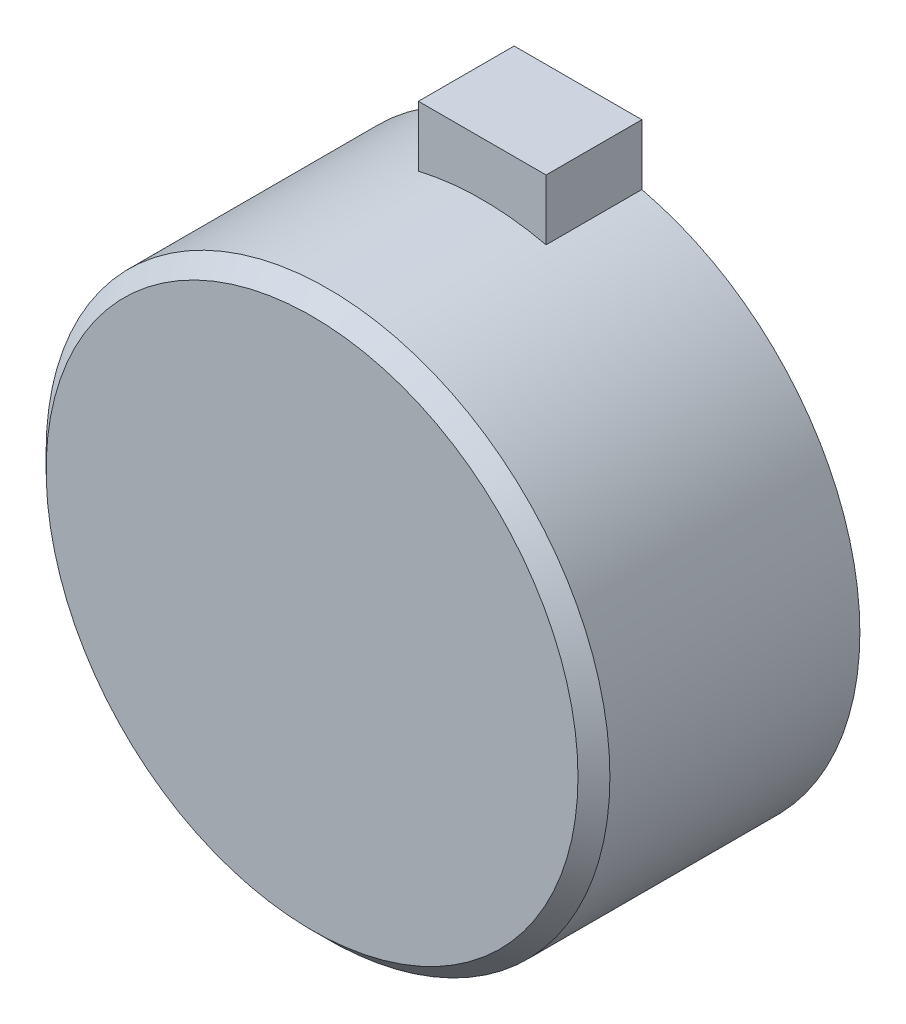
ISO-10303-21;
HEADER;
FILE_DESCRIPTION(('STEP AP214'),'2;1');
FILE_NAME('part.step','',(''),(''),'','','');
FILE_SCHEMA(('AUTOMOTIVE_DESIGN { 1 0 10303 214 1 1 1 1 }'));
ENDSEC;
DATA;
#1=APPLICATION_CONTEXT('core data for automotive mechanical design processes');
#2=APPLICATION_PROTOCOL_DEFINITION('international standard','automotive_design',2000,#1);
#3=PRODUCT_CONTEXT('',#1,'mechanical');
#4=PRODUCT('Part','Part','',(#3));
#5=PRODUCT_RELATED_PRODUCT_CATEGORY('part','',(#4));
#6=PRODUCT_DEFINITION_FORMATION('','',#4);
#7=PRODUCT_DEFINITION_CONTEXT('part definition',#1,'design');
#8=PRODUCT_DEFINITION('design','',#6,#7);
#9=PRODUCT_DEFINITION_SHAPE('','',#8);
#10=(LENGTH_UNIT() NAMED_UNIT(*) SI_UNIT(.MILLI.,.METRE.));
#11=(NAMED_UNIT(*) PLANE_ANGLE_UNIT() SI_UNIT($,.RADIAN.));
#12=(NAMED_UNIT(*) SI_UNIT($,.STERADIAN.) SOLID_ANGLE_UNIT());
#13=UNCERTAINTY_MEASURE_WITH_UNIT(LENGTH_MEASURE(1.E-05),#10,'distance_accuracy_value','');
#14=(GEOMETRIC_REPRESENTATION_CONTEXT(3) GLOBAL_UNCERTAINTY_ASSIGNED_CONTEXT((#13)) GLOBAL_UNIT_ASSIGNED_CONTEXT((#10,
#11,#12)) REPRESENTATION_CONTEXT('',''));
#15=CARTESIAN_POINT('',(0.,0.,0.));
#16=DIRECTION('',(0.,0.,1.));
#17=DIRECTION('',(1.,0.,0.));
#18=AXIS2_PLACEMENT_3D('',#15,#16,#17);
#19=CARTESIAN_POINT('',(0.,0.,10.));
#20=DIRECTION('',(0.,0.,1.));
#21=DIRECTION('',(1.,0.,0.));
#22=AXIS2_PLACEMENT_3D('',#19,#20,#21);
#23=CYLINDRICAL_SURFACE('',#22,53.);
#24=CARTESIAN_POINT('',(0.,0.,-3.));
#25=DIRECTION('',(0.,0.,1.));
#26=DIRECTION('',(1.,0.,0.));
#27=AXIS2_PLACEMENT_3D('',#24,#25,#26);
#28=CIRCLE('',#27,53.);
#29=CARTESIAN_POINT('',(53.,0.,-3.));
#30=VERTEX_POINT('',#29);
#31=EDGE_CURVE('E161',#30,#30,#28,.T.);
#32=ORIENTED_EDGE('',*,*,#31,.F.);
#33=EDGE_LOOP('',(#32));
#34=FACE_BOUND('',#33,.T.);
#35=CARTESIAN_POINT('',(0.,0.,-32.));
#36=DIRECTION('',(0.,0.,1.));
#37=DIRECTION('',(1.,0.,0.));
#38=AXIS2_PLACEMENT_3D('',#35,#36,#37);
#39=CIRCLE('',#38,53.);
#40=CARTESIAN_POINT('',(-12.,51.6236379965612,-32.));
#41=VERTEX_POINT('',#40);
#42=CARTESIAN_POINT('',(12.,51.6236379965612,-32.));
#43=VERTEX_POINT('',#42);
#44=EDGE_CURVE('E11',#41,#43,#39,.F.);
#45=ORIENTED_EDGE('',*,*,#44,.F.);
#46=DIRECTION('',(0.,0.,1.));
#47=VECTOR('',#46,1.);
#48=CARTESIAN_POINT('',(-12.,51.6236379965612,10.));
#49=LINE('',#48,#47);
#50=CARTESIAN_POINT('',(-12.,51.6236379965612,-50.));
#51=VERTEX_POINT('',#50);
#52=EDGE_CURVE('E57',#41,#51,#49,.F.);
#53=ORIENTED_EDGE('',*,*,#52,.T.);
#54=CARTESIAN_POINT('',(0.,0.,-50.));
#55=DIRECTION('',(0.,0.,1.));
#56=DIRECTION('',(1.,0.,0.));
#57=AXIS2_PLACEMENT_3D('',#54,#55,#56);
#58=CIRCLE('',#57,53.);
#59=CARTESIAN_POINT('',(12.,51.6236379965612,-50.));
#60=VERTEX_POINT('',#59);
#61=EDGE_CURVE('E160',#51,#60,#58,.T.);
#62=ORIENTED_EDGE('',*,*,#61,.T.);
#63=DIRECTION('',(0.,0.,1.));
#64=VECTOR('',#63,1.);
#65=CARTESIAN_POINT('',(12.,51.6236379965612,10.));
#66=LINE('',#65,#64);
#67=EDGE_CURVE('E91',#60,#43,#66,.T.);
#68=ORIENTED_EDGE('',*,*,#67,.T.);
#69=EDGE_LOOP('',(#45,#53,#62,#68));
#70=FACE_BOUND('',#69,.T.);
#71=ADVANCED_FACE('F39',(#34,#70),#23,.T.);
#72=CARTESIAN_POINT('',(0.,0.,0.));
#73=DIRECTION('',(0.,0.,1.));
#74=DIRECTION('',(1.,0.,0.));
#75=AXIS2_PLACEMENT_3D('',#72,#73,#74);
#76=PLANE('',#75);
#77=CARTESIAN_POINT('',(0.,0.,0.));
#78=DIRECTION('',(0.,0.,1.));
#79=DIRECTION('',(1.,0.,0.));
#80=AXIS2_PLACEMENT_3D('',#77,#78,#79);
#81=CIRCLE('',#80,50.);
#82=CARTESIAN_POINT('',(50.,0.,0.));
#83=VERTEX_POINT('',#82);
#84=EDGE_CURVE('E50',#83,#83,#81,.T.);
#85=ORIENTED_EDGE('',*,*,#84,.T.);
#86=EDGE_LOOP('',(#85));
#87=FACE_BOUND('',#86,.T.);
#88=ADVANCED_FACE('F41',(#87),#76,.T.);
#89=CARTESIAN_POINT('',(0.,0.,0.));
#90=DIRECTION('',(0.,0.,-1.));
#91=DIRECTION('',(-1.,0.,0.));
#92=AXIS2_PLACEMENT_3D('',#89,#90,#91);
#93=CONICAL_SURFACE('',#92,50.,0.785398163397449);
#94=ORIENTED_EDGE('',*,*,#31,.T.);
#95=EDGE_LOOP('',(#94));
#96=FACE_BOUND('',#95,.T.);
#97=ORIENTED_EDGE('',*,*,#84,.F.);
#98=EDGE_LOOP('',(#97));
#99=FACE_BOUND('',#98,.T.);
#100=ADVANCED_FACE('F170',(#96,#99),#93,.T.);
#101=CARTESIAN_POINT('',(50.,0.,-50.));
#102=DIRECTION('',(0.,0.,-1.));
#103=DIRECTION('',(-1.,0.,0.));
#104=AXIS2_PLACEMENT_3D('',#101,#102,#103);
#105=PLANE('',#104);
#106=ORIENTED_EDGE('',*,*,#61,.F.);
#107=DIRECTION('',(0.,-1.,0.));
#108=VECTOR('',#107,1.);
#109=CARTESIAN_POINT('',(-12.,63.,-50.));
#110=LINE('',#109,#108);
#111=CARTESIAN_POINT('',(-12.,63.,-50.));
#112=VERTEX_POINT('',#111);
#113=EDGE_CURVE('E103',#112,#51,#110,.T.);
#114=ORIENTED_EDGE('',*,*,#113,.F.);
#115=DIRECTION('',(-1.,0.,0.));
#116=VECTOR('',#115,1.);
#117=CARTESIAN_POINT('',(12.,63.,-50.));
#118=LINE('',#117,#116);
#119=CARTESIAN_POINT('',(12.,63.,-50.));
#120=VERTEX_POINT('',#119);
#121=EDGE_CURVE('E110',#120,#112,#118,.T.);
#122=ORIENTED_EDGE('',*,*,#121,.F.);
#123=DIRECTION('',(0.,1.,0.));
#124=VECTOR('',#123,1.);
#125=CARTESIAN_POINT('',(12.,49.,-50.));
#126=LINE('',#125,#124);
#127=EDGE_CURVE('E89',#60,#120,#126,.T.);
#128=ORIENTED_EDGE('',*,*,#127,.F.);
#129=EDGE_LOOP('',(#106,#114,#122,#128));
#130=FACE_BOUND('',#129,.T.);
#131=CARTESIAN_POINT('',(0.,43.,-50.));
#132=DIRECTION('',(0.,0.,1.));
#133=DIRECTION('',(0.,1.,0.));
#134=AXIS2_PLACEMENT_3D('',#131,#132,#133);
#135=CIRCLE('',#134,1.65);
#136=CARTESIAN_POINT('',(0.,44.65,-50.));
#137=VERTEX_POINT('',#136);
#138=EDGE_CURVE('E126',#137,#137,#135,.T.);
#139=ORIENTED_EDGE('',*,*,#138,.T.);
#140=EDGE_LOOP('',(#139));
#141=FACE_BOUND('',#140,.T.);
#142=CARTESIAN_POINT('',(-30.4055915910215,30.4055915910215,-50.));
#143=DIRECTION('',(0.,0.,1.));
#144=DIRECTION('',(-0.707106781186547,0.707106781186548,0.));
#145=AXIS2_PLACEMENT_3D('',#142,#143,#144);
#146=CIRCLE('',#145,1.65);
#147=CARTESIAN_POINT('',(-31.5723177799793,31.5723177799793,-50.));
#148=VERTEX_POINT('',#147);
#149=EDGE_CURVE('E133',#148,#148,#146,.T.);
#150=ORIENTED_EDGE('',*,*,#149,.T.);
#151=EDGE_LOOP('',(#150));
#152=FACE_BOUND('',#151,.T.);
#153=CARTESIAN_POINT('',(-43.,0.,-50.));
#154=DIRECTION('',(0.,0.,1.));
#155=DIRECTION('',(-1.,0.,0.));
#156=AXIS2_PLACEMENT_3D('',#153,#154,#155);
#157=CIRCLE('',#156,1.65);
#158=CARTESIAN_POINT('',(-44.65,0.,-50.));
#159=VERTEX_POINT('',#158);
#160=EDGE_CURVE('E140',#159,#159,#157,.T.);
#161=ORIENTED_EDGE('',*,*,#160,.T.);
#162=EDGE_LOOP('',(#161));
#163=FACE_BOUND('',#162,.T.);
#164=CARTESIAN_POINT('',(-30.4055915910215,-30.4055915910215,-50.));
#165=DIRECTION('',(0.,0.,1.));
#166=DIRECTION('',(-0.707106781186548,-0.707106781186547,0.));
#167=AXIS2_PLACEMENT_3D('',#164,#165,#166);
#168=CIRCLE('',#167,1.65);
#169=CARTESIAN_POINT('',(-31.5723177799793,-31.5723177799793,-50.));
#170=VERTEX_POINT('',#169);
#171=EDGE_CURVE('E113',#170,#170,#168,.T.);
#172=ORIENTED_EDGE('',*,*,#171,.T.);
#173=EDGE_LOOP('',(#172));
#174=FACE_BOUND('',#173,.T.);
#175=CARTESIAN_POINT('',(0.,-43.,-50.));
#176=DIRECTION('',(0.,0.,1.));
#177=DIRECTION('',(0.,-1.,0.));
#178=AXIS2_PLACEMENT_3D('',#175,#176,#177);
#179=CIRCLE('',#178,1.65);
#180=CARTESIAN_POINT('',(0.,-44.65,-50.));
#181=VERTEX_POINT('',#180);
#182=EDGE_CURVE('E119',#181,#181,#179,.T.);
#183=ORIENTED_EDGE('',*,*,#182,.T.);
#184=EDGE_LOOP('',(#183));
#185=FACE_BOUND('',#184,.T.);
#186=CARTESIAN_POINT('',(30.4055915910215,-30.4055915910215,-50.));
#187=DIRECTION('',(0.,0.,1.));
#188=DIRECTION('',(0.707106781186547,-0.707106781186548,0.));
#189=AXIS2_PLACEMENT_3D('',#186,#187,#188);
#190=CIRCLE('',#189,1.65);
#191=CARTESIAN_POINT('',(31.5723177799793,-31.5723177799793,-50.));
#192=VERTEX_POINT('',#191);
#193=EDGE_CURVE('E112',#192,#192,#190,.T.);
#194=ORIENTED_EDGE('',*,*,#193,.T.);
#195=EDGE_LOOP('',(#194));
#196=FACE_BOUND('',#195,.T.);
#197=CARTESIAN_POINT('',(30.4055915910215,30.4055915910215,-50.));
#198=DIRECTION('',(0.,0.,1.));
#199=DIRECTION('',(0.707106781186548,0.707106781186548,0.));
#200=AXIS2_PLACEMENT_3D('',#197,#198,#199);
#201=CIRCLE('',#200,1.65);
#202=CARTESIAN_POINT('',(31.5723177799793,31.5723177799793,-50.));
#203=VERTEX_POINT('',#202);
#204=EDGE_CURVE('E130',#203,#203,#201,.T.);
#205=ORIENTED_EDGE('',*,*,#204,.T.);
#206=EDGE_LOOP('',(#205));
#207=FACE_BOUND('',#206,.T.);
#208=CARTESIAN_POINT('',(43.,0.,-50.));
#209=DIRECTION('',(0.,0.,1.));
#210=DIRECTION('',(1.,0.,0.));
#211=AXIS2_PLACEMENT_3D('',#208,#209,#210);
#212=CIRCLE('',#211,1.65);
#213=CARTESIAN_POINT('',(44.65,0.,-50.));
#214=VERTEX_POINT('',#213);
#215=EDGE_CURVE('E151',#214,#214,#212,.T.);
#216=ORIENTED_EDGE('',*,*,#215,.T.);
#217=EDGE_LOOP('',(#216));
#218=FACE_BOUND('',#217,.T.);
#219=ADVANCED_FACE('F166',(#130,#141,#152,#163,#174,#185,#196,#207,#218),#105,.T.);
#220=CARTESIAN_POINT('',(43.,0.,-42.));
#221=DIRECTION('',(0.,0.,-1.));
#222=DIRECTION('',(-1.,0.,0.));
#223=AXIS2_PLACEMENT_3D('',#220,#221,#222);
#224=CYLINDRICAL_SURFACE('',#223,1.65);
#225=CARTESIAN_POINT('',(43.,0.,-42.));
#226=DIRECTION('',(0.,0.,1.));
#227=DIRECTION('',(1.,0.,0.));
#228=AXIS2_PLACEMENT_3D('',#225,#226,#227);
#229=CIRCLE('',#228,1.65);
#230=CARTESIAN_POINT('',(44.65,0.,-42.));
#231=VERTEX_POINT('',#230);
#232=EDGE_CURVE('E152',#231,#231,#229,.T.);
#233=ORIENTED_EDGE('',*,*,#232,.T.);
#234=EDGE_LOOP('',(#233));
#235=FACE_BOUND('',#234,.T.);
#236=ORIENTED_EDGE('',*,*,#215,.F.);
#237=EDGE_LOOP('',(#236));
#238=FACE_BOUND('',#237,.T.);
#239=ADVANCED_FACE('F176',(#235,#238),#224,.F.);
#240=CARTESIAN_POINT('',(43.,0.,-42.));
#241=DIRECTION('',(0.,0.,1.));
#242=DIRECTION('',(1.,0.,0.));
#243=AXIS2_PLACEMENT_3D('',#240,#241,#242);
#244=PLANE('',#243);
#245=ORIENTED_EDGE('',*,*,#232,.F.);
#246=EDGE_LOOP('',(#245));
#247=FACE_BOUND('',#246,.T.);
#248=ADVANCED_FACE('F190',(#247),#244,.F.);
#249=CARTESIAN_POINT('',(30.4055915910215,30.4055915910215,-42.));
#250=DIRECTION('',(0.,0.,-1.));
#251=DIRECTION('',(-1.,0.,0.));
#252=AXIS2_PLACEMENT_3D('',#249,#250,#251);
#253=CYLINDRICAL_SURFACE('',#252,1.65);
#254=CARTESIAN_POINT('',(30.4055915910215,30.4055915910215,-42.));
#255=DIRECTION('',(0.,0.,1.));
#256=DIRECTION('',(0.707106781186548,0.707106781186548,0.));
#257=AXIS2_PLACEMENT_3D('',#254,#255,#256);
#258=CIRCLE('',#257,1.65);
#259=CARTESIAN_POINT('',(31.5723177799793,31.5723177799793,-42.));
#260=VERTEX_POINT('',#259);
#261=EDGE_CURVE('E146',#260,#260,#258,.T.);
#262=ORIENTED_EDGE('',*,*,#261,.T.);
#263=EDGE_LOOP('',(#262));
#264=FACE_BOUND('',#263,.T.);
#265=ORIENTED_EDGE('',*,*,#204,.F.);
#266=EDGE_LOOP('',(#265));
#267=FACE_BOUND('',#266,.T.);
#268=ADVANCED_FACE('F192',(#264,#267),#253,.F.);
#269=CARTESIAN_POINT('',(30.4055915910215,30.4055915910215,-42.));
#270=DIRECTION('',(0.,0.,1.));
#271=DIRECTION('',(0.707106781186548,0.707106781186548,0.));
#272=AXIS2_PLACEMENT_3D('',#269,#270,#271);
#273=PLANE('',#272);
#274=ORIENTED_EDGE('',*,*,#261,.F.);
#275=EDGE_LOOP('',(#274));
#276=FACE_BOUND('',#275,.T.);
#277=ADVANCED_FACE('F198',(#276),#273,.F.);
#278=CARTESIAN_POINT('',(30.4055915910215,-30.4055915910215,-42.));
#279=DIRECTION('',(0.,0.,-1.));
#280=DIRECTION('',(-1.,0.,0.));
#281=AXIS2_PLACEMENT_3D('',#278,#279,#280);
#282=CYLINDRICAL_SURFACE('',#281,1.65);
#283=CARTESIAN_POINT('',(30.4055915910215,-30.4055915910215,-42.));
#284=DIRECTION('',(0.,0.,1.));
#285=DIRECTION('',(0.707106781186547,-0.707106781186548,0.));
#286=AXIS2_PLACEMENT_3D('',#283,#284,#285);
#287=CIRCLE('',#286,1.65);
#288=CARTESIAN_POINT('',(31.5723177799793,-31.5723177799793,-42.));
#289=VERTEX_POINT('',#288);
#290=EDGE_CURVE('E118',#289,#289,#287,.T.);
#291=ORIENTED_EDGE('',*,*,#290,.T.);
#292=EDGE_LOOP('',(#291));
#293=FACE_BOUND('',#292,.T.);
#294=ORIENTED_EDGE('',*,*,#193,.F.);
#295=EDGE_LOOP('',(#294));
#296=FACE_BOUND('',#295,.T.);
#297=ADVANCED_FACE('F199',(#293,#296),#282,.F.);
#298=CARTESIAN_POINT('',(30.4055915910215,-30.4055915910215,-42.));
#299=DIRECTION('',(0.,0.,1.));
#300=DIRECTION('',(0.707106781186547,-0.707106781186548,0.));
#301=AXIS2_PLACEMENT_3D('',#298,#299,#300);
#302=PLANE('',#301);
#303=ORIENTED_EDGE('',*,*,#290,.F.);
#304=EDGE_LOOP('',(#303));
#305=FACE_BOUND('',#304,.T.);
#306=ADVANCED_FACE('F240',(#305),#302,.F.);
#307=CARTESIAN_POINT('',(0.,-43.,-42.));
#308=DIRECTION('',(0.,0.,-1.));
#309=DIRECTION('',(-1.,0.,0.));
#310=AXIS2_PLACEMENT_3D('',#307,#308,#309);
#311=CYLINDRICAL_SURFACE('',#310,1.65);
#312=CARTESIAN_POINT('',(0.,-43.,-42.));
#313=DIRECTION('',(0.,0.,1.));
#314=DIRECTION('',(0.,-1.,0.));
#315=AXIS2_PLACEMENT_3D('',#312,#313,#314);
#316=CIRCLE('',#315,1.65);
#317=CARTESIAN_POINT('',(0.,-44.65,-42.));
#318=VERTEX_POINT('',#317);
#319=EDGE_CURVE('E115',#318,#318,#316,.T.);
#320=ORIENTED_EDGE('',*,*,#319,.T.);
#321=EDGE_LOOP('',(#320));
#322=FACE_BOUND('',#321,.T.);
#323=ORIENTED_EDGE('',*,*,#182,.F.);
#324=EDGE_LOOP('',(#323));
#325=FACE_BOUND('',#324,.T.);
#326=ADVANCED_FACE('F244',(#322,#325),#311,.F.);
#327=CARTESIAN_POINT('',(0.,-43.,-42.));
#328=DIRECTION('',(0.,0.,1.));
#329=DIRECTION('',(0.,-1.,0.));
#330=AXIS2_PLACEMENT_3D('',#327,#328,#329);
#331=PLANE('',#330);
#332=ORIENTED_EDGE('',*,*,#319,.F.);
#333=EDGE_LOOP('',(#332));
#334=FACE_BOUND('',#333,.T.);
#335=ADVANCED_FACE('F206',(#334),#331,.F.);
#336=CARTESIAN_POINT('',(-30.4055915910215,-30.4055915910215,-42.));
#337=DIRECTION('',(0.,0.,-1.));
#338=DIRECTION('',(-1.,0.,0.));
#339=AXIS2_PLACEMENT_3D('',#336,#337,#338);
#340=CYLINDRICAL_SURFACE('',#339,1.65);
#341=CARTESIAN_POINT('',(-30.4055915910215,-30.4055915910215,-42.));
#342=DIRECTION('',(0.,0.,1.));
#343=DIRECTION('',(-0.707106781186548,-0.707106781186547,0.));
#344=AXIS2_PLACEMENT_3D('',#341,#342,#343);
#345=CIRCLE('',#344,1.65);
#346=CARTESIAN_POINT('',(-31.5723177799793,-31.5723177799793,-42.));
#347=VERTEX_POINT('',#346);
#348=EDGE_CURVE('E141',#347,#347,#345,.T.);
#349=ORIENTED_EDGE('',*,*,#348,.T.);
#350=EDGE_LOOP('',(#349));
#351=FACE_BOUND('',#350,.T.);
#352=ORIENTED_EDGE('',*,*,#171,.F.);
#353=EDGE_LOOP('',(#352));
#354=FACE_BOUND('',#353,.T.);
#355=ADVANCED_FACE('F205',(#351,#354),#340,.F.);
#356=CARTESIAN_POINT('',(-30.4055915910215,-30.4055915910215,-42.));
#357=DIRECTION('',(0.,0.,1.));
#358=DIRECTION('',(-0.707106781186548,-0.707106781186547,0.));
#359=AXIS2_PLACEMENT_3D('',#356,#357,#358);
#360=PLANE('',#359);
#361=ORIENTED_EDGE('',*,*,#348,.F.);
#362=EDGE_LOOP('',(#361));
#363=FACE_BOUND('',#362,.T.);
#364=ADVANCED_FACE('F202',(#363),#360,.F.);
#365=CARTESIAN_POINT('',(-43.,0.,-42.));
#366=DIRECTION('',(0.,0.,-1.));
#367=DIRECTION('',(-1.,0.,0.));
#368=AXIS2_PLACEMENT_3D('',#365,#366,#367);
#369=CYLINDRICAL_SURFACE('',#368,1.65);
#370=CARTESIAN_POINT('',(-43.,0.,-42.));
#371=DIRECTION('',(0.,0.,1.));
#372=DIRECTION('',(-1.,0.,0.));
#373=AXIS2_PLACEMENT_3D('',#370,#371,#372);
#374=CIRCLE('',#373,1.65);
#375=CARTESIAN_POINT('',(-44.65,0.,-42.));
#376=VERTEX_POINT('',#375);
#377=EDGE_CURVE('E137',#376,#376,#374,.T.);
#378=ORIENTED_EDGE('',*,*,#377,.T.);
#379=EDGE_LOOP('',(#378));
#380=FACE_BOUND('',#379,.T.);
#381=ORIENTED_EDGE('',*,*,#160,.F.);
#382=EDGE_LOOP('',(#381));
#383=FACE_BOUND('',#382,.T.);
#384=ADVANCED_FACE('F209',(#380,#383),#369,.F.);
#385=CARTESIAN_POINT('',(-43.,0.,-42.));
#386=DIRECTION('',(0.,0.,1.));
#387=DIRECTION('',(-1.,0.,0.));
#388=AXIS2_PLACEMENT_3D('',#385,#386,#387);
#389=PLANE('',#388);
#390=ORIENTED_EDGE('',*,*,#377,.F.);
#391=EDGE_LOOP('',(#390));
#392=FACE_BOUND('',#391,.T.);
#393=ADVANCED_FACE('F212',(#392),#389,.F.);
#394=CARTESIAN_POINT('',(-30.4055915910215,30.4055915910215,-42.));
#395=DIRECTION('',(0.,0.,-1.));
#396=DIRECTION('',(-1.,0.,0.));
#397=AXIS2_PLACEMENT_3D('',#394,#395,#396);
#398=CYLINDRICAL_SURFACE('',#397,1.65);
#399=CARTESIAN_POINT('',(-30.4055915910215,30.4055915910215,-42.));
#400=DIRECTION('',(0.,0.,1.));
#401=DIRECTION('',(-0.707106781186547,0.707106781186548,0.));
#402=AXIS2_PLACEMENT_3D('',#399,#400,#401);
#403=CIRCLE('',#402,1.65);
#404=CARTESIAN_POINT('',(-31.5723177799793,31.5723177799793,-42.));
#405=VERTEX_POINT('',#404);
#406=EDGE_CURVE('E134',#405,#405,#403,.T.);
#407=ORIENTED_EDGE('',*,*,#406,.T.);
#408=EDGE_LOOP('',(#407));
#409=FACE_BOUND('',#408,.T.);
#410=ORIENTED_EDGE('',*,*,#149,.F.);
#411=EDGE_LOOP('',(#410));
#412=FACE_BOUND('',#411,.T.);
#413=ADVANCED_FACE('F217',(#409,#412),#398,.F.);
#414=CARTESIAN_POINT('',(-30.4055915910215,30.4055915910215,-42.));
#415=DIRECTION('',(0.,0.,1.));
#416=DIRECTION('',(-0.707106781186547,0.707106781186548,0.));
#417=AXIS2_PLACEMENT_3D('',#414,#415,#416);
#418=PLANE('',#417);
#419=ORIENTED_EDGE('',*,*,#406,.F.);
#420=EDGE_LOOP('',(#419));
#421=FACE_BOUND('',#420,.T.);
#422=ADVANCED_FACE('F225',(#421),#418,.F.);
#423=CARTESIAN_POINT('',(0.,43.,-42.));
#424=DIRECTION('',(0.,0.,-1.));
#425=DIRECTION('',(-1.,0.,0.));
#426=AXIS2_PLACEMENT_3D('',#423,#424,#425);
#427=CYLINDRICAL_SURFACE('',#426,1.65);
#428=CARTESIAN_POINT('',(0.,43.,-42.));
#429=DIRECTION('',(0.,0.,1.));
#430=DIRECTION('',(0.,1.,0.));
#431=AXIS2_PLACEMENT_3D('',#428,#429,#430);
#432=CIRCLE('',#431,1.65);
#433=CARTESIAN_POINT('',(0.,44.65,-42.));
#434=VERTEX_POINT('',#433);
#435=EDGE_CURVE('E123',#434,#434,#432,.T.);
#436=ORIENTED_EDGE('',*,*,#435,.T.);
#437=EDGE_LOOP('',(#436));
#438=FACE_BOUND('',#437,.T.);
#439=ORIENTED_EDGE('',*,*,#138,.F.);
#440=EDGE_LOOP('',(#439));
#441=FACE_BOUND('',#440,.T.);
#442=ADVANCED_FACE('F229',(#438,#441),#427,.F.);
#443=CARTESIAN_POINT('',(0.,43.,-42.));
#444=DIRECTION('',(0.,0.,1.));
#445=DIRECTION('',(0.,1.,0.));
#446=AXIS2_PLACEMENT_3D('',#443,#444,#445);
#447=PLANE('',#446);
#448=ORIENTED_EDGE('',*,*,#435,.F.);
#449=EDGE_LOOP('',(#448));
#450=FACE_BOUND('',#449,.T.);
#451=ADVANCED_FACE('F227',(#450),#447,.F.);
#452=CARTESIAN_POINT('',(-12.,63.,-32.));
#453=DIRECTION('',(1.,0.,0.));
#454=DIRECTION('',(0.,0.,-1.));
#455=AXIS2_PLACEMENT_3D('',#452,#453,#454);
#456=PLANE('',#455);
#457=ORIENTED_EDGE('',*,*,#52,.F.);
#458=DIRECTION('',(0.,-1.,0.));
#459=VECTOR('',#458,1.);
#460=CARTESIAN_POINT('',(-12.,63.,-32.));
#461=LINE('',#460,#459);
#462=CARTESIAN_POINT('',(-12.,63.,-32.));
#463=VERTEX_POINT('',#462);
#464=EDGE_CURVE('E83',#463,#41,#461,.T.);
#465=ORIENTED_EDGE('',*,*,#464,.F.);
#466=DIRECTION('',(0.,0.,-1.));
#467=VECTOR('',#466,1.);
#468=CARTESIAN_POINT('',(-12.,63.,-32.));
#469=LINE('',#468,#467);
#470=EDGE_CURVE('E94',#463,#112,#469,.T.);
#471=ORIENTED_EDGE('',*,*,#470,.T.);
#472=ORIENTED_EDGE('',*,*,#113,.T.);
#473=EDGE_LOOP('',(#457,#465,#471,#472));
#474=FACE_BOUND('',#473,.T.);
#475=ADVANCED_FACE('F234',(#474),#456,.F.);
#476=CARTESIAN_POINT('',(12.,49.,-32.));
#477=DIRECTION('',(-1.,0.,0.));
#478=DIRECTION('',(0.,0.,1.));
#479=AXIS2_PLACEMENT_3D('',#476,#477,#478);
#480=PLANE('',#479);
#481=ORIENTED_EDGE('',*,*,#67,.F.);
#482=ORIENTED_EDGE('',*,*,#127,.T.);
#483=DIRECTION('',(0.,0.,-1.));
#484=VECTOR('',#483,1.);
#485=CARTESIAN_POINT('',(12.,63.,-32.));
#486=LINE('',#485,#484);
#487=CARTESIAN_POINT('',(12.,63.,-32.));
#488=VERTEX_POINT('',#487);
#489=EDGE_CURVE('E87',#488,#120,#486,.T.);
#490=ORIENTED_EDGE('',*,*,#489,.F.);
#491=DIRECTION('',(0.,1.,0.));
#492=VECTOR('',#491,1.);
#493=CARTESIAN_POINT('',(12.,49.,-32.));
#494=LINE('',#493,#492);
#495=EDGE_CURVE('E73',#43,#488,#494,.T.);
#496=ORIENTED_EDGE('',*,*,#495,.F.);
#497=EDGE_LOOP('',(#481,#482,#490,#496));
#498=FACE_BOUND('',#497,.T.);
#499=ADVANCED_FACE('F86',(#498),#480,.F.);
#500=CARTESIAN_POINT('',(12.,63.,-32.));
#501=DIRECTION('',(0.,-1.,0.));
#502=DIRECTION('',(0.,0.,-1.));
#503=AXIS2_PLACEMENT_3D('',#500,#501,#502);
#504=PLANE('',#503);
#505=ORIENTED_EDGE('',*,*,#121,.T.);
#506=ORIENTED_EDGE('',*,*,#470,.F.);
#507=DIRECTION('',(-1.,0.,0.));
#508=VECTOR('',#507,1.);
#509=CARTESIAN_POINT('',(12.,63.,-32.));
#510=LINE('',#509,#508);
#511=EDGE_CURVE('E77',#488,#463,#510,.T.);
#512=ORIENTED_EDGE('',*,*,#511,.F.);
#513=ORIENTED_EDGE('',*,*,#489,.T.);
#514=EDGE_LOOP('',(#505,#506,#512,#513));
#515=FACE_BOUND('',#514,.T.);
#516=ADVANCED_FACE('F96',(#515),#504,.F.);
#517=CARTESIAN_POINT('',(0.,0.,-32.));
#518=DIRECTION('',(0.,0.,1.));
#519=DIRECTION('',(1.,0.,0.));
#520=AXIS2_PLACEMENT_3D('',#517,#518,#519);
#521=PLANE('',#520);
#522=ORIENTED_EDGE('',*,*,#464,.T.);
#523=ORIENTED_EDGE('',*,*,#44,.T.);
#524=ORIENTED_EDGE('',*,*,#495,.T.);
#525=ORIENTED_EDGE('',*,*,#511,.T.);
#526=EDGE_LOOP('',(#522,#523,#524,#525));
#527=FACE_BOUND('',#526,.T.);
#528=ADVANCED_FACE('F80',(#527),#521,.T.);
#529=CLOSED_SHELL('',(#71,#88,#100,#219,#239,#248,#268,#277,#297,#306,#326,#335,#355,#364,#384,
#393,#413,#422,#442,#451,#475,#499,#516,#528));
#530=MANIFOLD_SOLID_BREP('B2',#529);
#531=ADVANCED_BREP_SHAPE_REPRESENTATION('',(#18,#530),#14);
#532=SHAPE_DEFINITION_REPRESENTATION(#9,#531);
ENDSEC;
END-ISO-10303-21;
